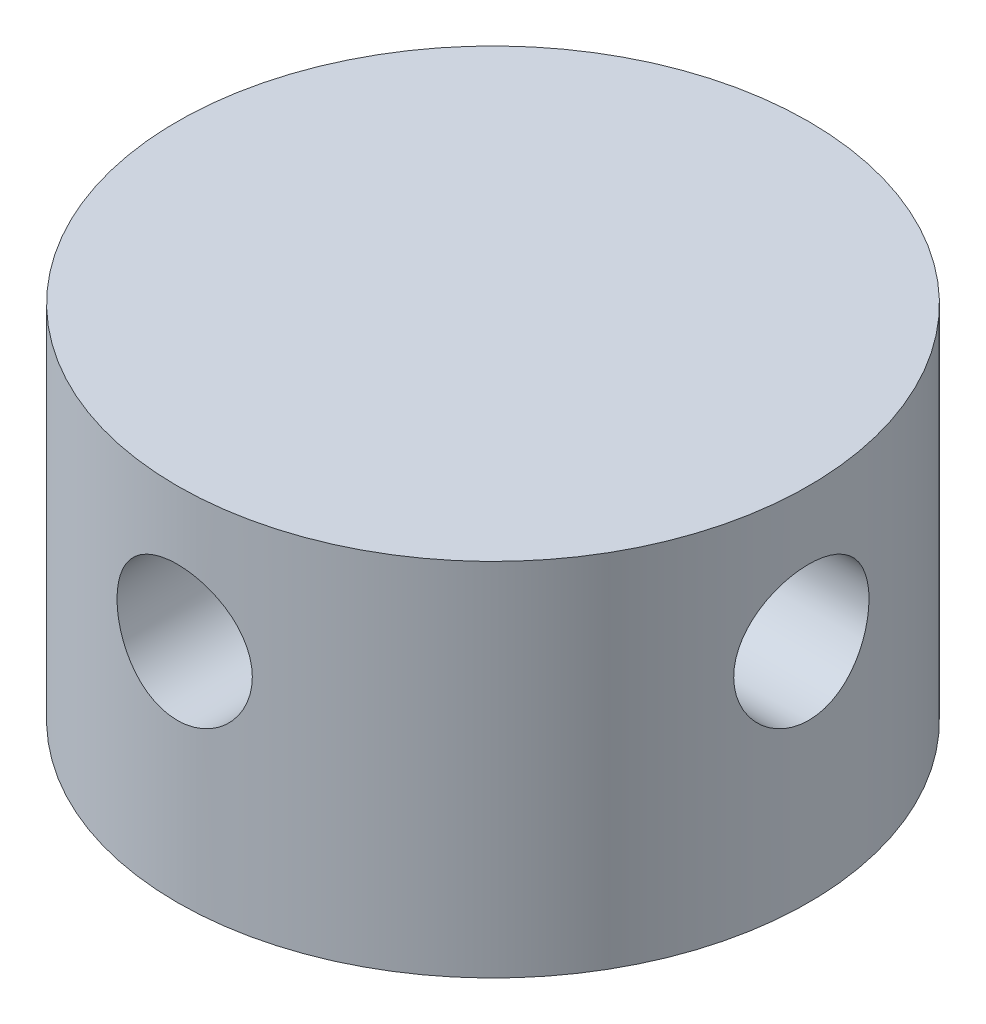
ISO-10303-21;
HEADER;
FILE_DESCRIPTION(('STEP AP214'),'2;1');
FILE_NAME('part.step','',(''),(''),'','','');
FILE_SCHEMA(('AUTOMOTIVE_DESIGN { 1 0 10303 214 1 1 1 1 }'));
ENDSEC;
DATA;
#1=APPLICATION_CONTEXT('core data for automotive mechanical design processes');
#2=APPLICATION_PROTOCOL_DEFINITION('international standard','automotive_design',2000,#1);
#3=PRODUCT_CONTEXT('',#1,'mechanical');
#4=PRODUCT('Part','Part','',(#3));
#5=PRODUCT_RELATED_PRODUCT_CATEGORY('part','',(#4));
#6=PRODUCT_DEFINITION_FORMATION('','',#4);
#7=PRODUCT_DEFINITION_CONTEXT('part definition',#1,'design');
#8=PRODUCT_DEFINITION('design','',#6,#7);
#9=PRODUCT_DEFINITION_SHAPE('','',#8);
#10=(LENGTH_UNIT() NAMED_UNIT(*) SI_UNIT(.MILLI.,.METRE.));
#11=(NAMED_UNIT(*) PLANE_ANGLE_UNIT() SI_UNIT($,.RADIAN.));
#12=(NAMED_UNIT(*) SI_UNIT($,.STERADIAN.) SOLID_ANGLE_UNIT());
#13=UNCERTAINTY_MEASURE_WITH_UNIT(LENGTH_MEASURE(1.E-05),#10,'distance_accuracy_value','');
#14=(GEOMETRIC_REPRESENTATION_CONTEXT(3) GLOBAL_UNCERTAINTY_ASSIGNED_CONTEXT((#13)) GLOBAL_UNIT_ASSIGNED_CONTEXT((#10,
#11,#12)) REPRESENTATION_CONTEXT('',''));
#15=CARTESIAN_POINT('',(0.,0.,0.));
#16=DIRECTION('',(0.,0.,1.));
#17=DIRECTION('',(1.,0.,0.));
#18=AXIS2_PLACEMENT_3D('',#15,#16,#17);
#19=CARTESIAN_POINT('',(0.,16.,0.));
#20=DIRECTION('',(0.,-1.,0.));
#21=DIRECTION('',(0.,0.,-1.));
#22=AXIS2_PLACEMENT_3D('',#19,#20,#21);
#23=CYLINDRICAL_SURFACE('',#22,14.);
#24=CARTESIAN_POINT('',(2.99999999999995,9.99536264570849,13.6747943311774));
#25=CARTESIAN_POINT('',(2.99999416477348,9.82894034074246,13.6747976912119));
#26=CARTESIAN_POINT('',(2.98610472489565,9.66244709782367,13.6778654468474));
#27=CARTESIAN_POINT('',(2.9309711850596,9.33418930122505,13.6897835685885));
#28=CARTESIAN_POINT('',(2.8897067930723,9.17242834835623,13.6986382242345));
#29=CARTESIAN_POINT('',(2.78117727369203,8.85843114655992,13.7210823058705));
#30=CARTESIAN_POINT('',(2.71394001982626,8.70618488946551,13.7346666545171));
#31=CARTESIAN_POINT('',(2.55545235346674,8.4151320978193,13.7650334169723));
#32=CARTESIAN_POINT('',(2.46420264097546,8.27632517165034,13.7818157375507));
#33=CARTESIAN_POINT('',(2.25870285140437,8.01383672274423,13.8169915759333));
#34=CARTESIAN_POINT('',(2.14413718967961,7.89040489322856,13.8354049974351));
#35=CARTESIAN_POINT('',(1.8959390162591,7.66435553689692,13.8715938342079));
#36=CARTESIAN_POINT('',(1.7623050604353,7.56173958798835,13.8893692010283));
#37=CARTESIAN_POINT('',(1.47809457692912,7.37925175672562,13.9224953821887));
#38=CARTESIAN_POINT('',(1.32736097645986,7.29961933416725,13.9378199763886));
#39=CARTESIAN_POINT('',(1.01426853868514,7.1669072628159,13.9640934208587));
#40=CARTESIAN_POINT('',(0.851910954760575,7.11382475613592,13.9750427420666));
#41=CARTESIAN_POINT('',(0.522774375342975,7.0365027038458,13.9911913056236));
#42=CARTESIAN_POINT('',(0.356098801193798,7.01184078860363,13.9964746675677));
#43=CARTESIAN_POINT('',(0.0208978906132403,6.99074009108197,14.00098724414));
#44=CARTESIAN_POINT('',(-0.147627240329568,6.99429820458697,14.000217124654));
#45=CARTESIAN_POINT('',(-0.478834058501073,7.02922057503565,13.9927740172512));
#46=CARTESIAN_POINT('',(-0.641566230724274,7.06012964628833,13.9861976630486));
#47=CARTESIAN_POINT('',(-0.959478927956827,7.14815200941221,13.9679908317821));
#48=CARTESIAN_POINT('',(-1.11465912035016,7.20526645430797,13.9563601323304));
#49=CARTESIAN_POINT('',(-1.41433499511315,7.34448556348552,13.9291950929371));
#50=CARTESIAN_POINT('',(-1.55874731403163,7.42676418011718,13.9136337160789));
#51=CARTESIAN_POINT('',(-1.83188185312574,7.61384658203568,13.8803158748773));
#52=CARTESIAN_POINT('',(-1.96060201290311,7.71865332030909,13.8625591228939));
#53=CARTESIAN_POINT('',(-2.20140417600401,7.95029973476421,13.8263865292185));
#54=CARTESIAN_POINT('',(-2.31310234640506,8.07753780442256,13.807964607457));
#55=CARTESIAN_POINT('',(-2.51364486469461,8.3491292158455,13.7728713366395));
#56=CARTESIAN_POINT('',(-2.60248864236141,8.49348298451898,13.7562000312677));
#57=CARTESIAN_POINT('',(-2.75496155146598,8.79581164783601,13.7264804717344));
#58=CARTESIAN_POINT('',(-2.8185207017785,8.95382289341336,13.7134423025555));
#59=CARTESIAN_POINT('',(-2.91806990318236,9.27862817760136,13.6926068161323));
#60=CARTESIAN_POINT('',(-2.9540641338926,9.44542088059487,13.6848087043696));
#61=CARTESIAN_POINT('',(-2.99687172049309,9.77955415100791,13.6754976251089));
#62=CARTESIAN_POINT('',(-3.00424283857285,9.9468199958631,13.673864541034));
#63=CARTESIAN_POINT('',(-2.99110279284752,10.2801906320719,13.6767447914799));
#64=CARTESIAN_POINT('',(-2.97059346163275,10.4462954990156,13.6812577220212));
#65=CARTESIAN_POINT('',(-2.90275789271173,10.77070351567,13.6958083096841));
#66=CARTESIAN_POINT('',(-2.85573660503112,10.9290735109024,13.7057831054873));
#67=CARTESIAN_POINT('',(-2.73654105893504,11.2356873207743,13.7300771973955));
#68=CARTESIAN_POINT('',(-2.66436447325641,11.3839301969769,13.744396895457));
#69=CARTESIAN_POINT('',(-2.49567008833415,11.6685020152263,13.7760326816069));
#70=CARTESIAN_POINT('',(-2.39880737181589,11.8046218097329,13.7933900349263));
#71=CARTESIAN_POINT('',(-2.18394367667206,12.0588793374561,13.8290355072028));
#72=CARTESIAN_POINT('',(-2.06594018364327,12.1770149286054,13.8473237366892));
#73=CARTESIAN_POINT('',(-1.80962552884168,12.394103251598,13.8831647998035));
#74=CARTESIAN_POINT('',(-1.67098985165759,12.4926764780225,13.9006987121549));
#75=CARTESIAN_POINT('',(-1.3788029625646,12.6651334644106,13.932712214298));
#76=CARTESIAN_POINT('',(-1.22525243208753,12.7390183516541,13.9471919435339));
#77=CARTESIAN_POINT('',(-0.908530837964129,12.8594667549854,13.9713855676315));
#78=CARTESIAN_POINT('',(-0.745426386150395,12.906199253201,13.9811288760739));
#79=CARTESIAN_POINT('',(-0.413450354006625,12.9715460571731,13.9948787860397));
#80=CARTESIAN_POINT('',(-0.244579579948027,12.9901642776563,13.9988861862461));
#81=CARTESIAN_POINT('',(0.0905274341056023,12.9985839505322,14.000690220181));
#82=CARTESIAN_POINT('',(0.256749011018382,12.9889529629178,13.9986091800327));
#83=CARTESIAN_POINT('',(0.585145876831902,12.9424131186704,13.9887310472683));
#84=CARTESIAN_POINT('',(0.747321232810627,12.9055047145517,13.9809340494761));
#85=CARTESIAN_POINT('',(1.06260389697439,12.8057250332097,13.9605077727683));
#86=CARTESIAN_POINT('',(1.21573673014591,12.7429312669381,13.9478929286009));
#87=CARTESIAN_POINT('',(1.50936991344679,12.5932401033696,13.9191807210222));
#88=CARTESIAN_POINT('',(1.6498690895937,12.5063404690939,13.9030830344402));
#89=CARTESIAN_POINT('',(1.91702461378895,12.3090380082257,13.8687961986559));
#90=CARTESIAN_POINT('',(2.04338073020588,12.1982343290756,13.8505741780296));
#91=CARTESIAN_POINT('',(2.27590002915842,11.957081425198,13.8142738016446));
#92=CARTESIAN_POINT('',(2.38205836126937,11.8267275189607,13.7961954813913));
#93=CARTESIAN_POINT('',(2.57246523191557,11.5481816593692,13.761973872554));
#94=CARTESIAN_POINT('',(2.65641795611839,11.399783929263,13.7458581173137));
#95=CARTESIAN_POINT('',(2.79806009312266,11.0906752039917,13.7177299427787));
#96=CARTESIAN_POINT('',(2.85577212846055,10.9299749552366,13.7057139912142));
#97=CARTESIAN_POINT('',(2.93277214244337,10.6401103833161,13.6894112131582));
#98=CARTESIAN_POINT('',(2.95793505015813,10.5125392942873,13.683965661845));
#99=CARTESIAN_POINT('',(2.99155088086538,10.2551140225594,13.6766559900021));
#100=CARTESIAN_POINT('',(3.00000455455859,10.1252599426935,13.6747917085757));
#101=CARTESIAN_POINT('',(2.99999999999995,9.99536264570849,13.6747943311774));
#102=B_SPLINE_CURVE_WITH_KNOTS('',3,(#24,#25,#26,#27,#28,#29,#30,#31,#32,#33,#34,#35,#36,#37,
#38,#39,#40,#41,#42,#43,#44,#45,#46,#47,#48,#49,#50,#51,#52,#53,#54,#55,#56,#57,#58,#59,#60,#61,
#62,#63,#64,#65,#66,#67,#68,#69,#70,#71,#72,#73,#74,#75,#76,#77,#78,#79,#80,#81,#82,#83,#84,#85,
#86,#87,#88,#89,#90,#91,#92,#93,#94,#95,#96,#97,#98,#99,#100,#101),.UNSPECIFIED.,.T.,.F.,(4,2,2,
2,2,2,2,2,2,2,2,2,2,2,2,2,2,2,2,2,2,2,2,2,2,2,2,2,2,2,2,2,2,2,2,2,2,2,4),(0.,0.498790964055055,
0.997952076959928,1.49657898230552,1.99519135347057,2.50106459165384,3.00697616225757,
3.51798269640557,4.02893421292535,4.53219016303857,5.03539075554482,5.53037115334743,
6.02537333215167,6.52387776286874,7.0224475774463,7.5309792155859,8.03952354046184,
8.54946574823562,9.05933061907677,9.55920866385046,10.0590538530783,10.5532636149875,
11.047519111263,11.5491002043264,12.0507409931816,12.5613242936642,13.0718842775108,
13.5792317964875,14.0865086641708,14.5836639928825,15.080811074302,15.5764801923897,
16.0721953230273,16.5769782832193,17.0818823126246,17.593207603363,18.1040912322742,
18.4934291224859,18.8827495204009),.UNSPECIFIED.);
#103=CARTESIAN_POINT('',(2.99999999999995,9.99536264570849,13.6747943311774));
#104=VERTEX_POINT('',#103);
#105=EDGE_CURVE('E10',#104,#104,#102,.T.);
#106=ORIENTED_EDGE('',*,*,#105,.T.);
#107=EDGE_LOOP('',(#106));
#108=FACE_BOUND('',#107,.T.);
#109=CARTESIAN_POINT('',(-13.6747943311773,9.99536264570849,3.));
#110=CARTESIAN_POINT('',(-13.6747976912119,9.82894034074246,2.99999416477353));
#111=CARTESIAN_POINT('',(-13.6778654468474,9.66244709782367,2.9861047248957));
#112=CARTESIAN_POINT('',(-13.6897835685885,9.33418930122505,2.93097118505965));
#113=CARTESIAN_POINT('',(-13.6986382242345,9.17242834835623,2.88970679307235));
#114=CARTESIAN_POINT('',(-13.7210823058705,8.85843114655992,2.78117727369208));
#115=CARTESIAN_POINT('',(-13.7346666545171,8.70618488946551,2.71394001982631));
#116=CARTESIAN_POINT('',(-13.7650334169723,8.4151320978193,2.55545235346679));
#117=CARTESIAN_POINT('',(-13.7818157375507,8.27632517165034,2.46420264097551));
#118=CARTESIAN_POINT('',(-13.8169915759332,8.01383672274423,2.25870285140442));
#119=CARTESIAN_POINT('',(-13.8354049974351,7.89040489322856,2.14413718967966));
#120=CARTESIAN_POINT('',(-13.8715938342079,7.66435553689692,1.89593901625915));
#121=CARTESIAN_POINT('',(-13.8893692010283,7.56173958798835,1.76230506043535));
#122=CARTESIAN_POINT('',(-13.9224953821886,7.37925175672562,1.47809457692916));
#123=CARTESIAN_POINT('',(-13.9378199763886,7.29961933416725,1.32736097645991));
#124=CARTESIAN_POINT('',(-13.9640934208587,7.1669072628159,1.01426853868519));
#125=CARTESIAN_POINT('',(-13.9750427420666,7.11382475613593,0.851910954760624));
#126=CARTESIAN_POINT('',(-13.9911913056236,7.0365027038458,0.522774375343024));
#127=CARTESIAN_POINT('',(-13.9964746675677,7.01184078860363,0.356098801193847));
#128=CARTESIAN_POINT('',(-14.00098724414,6.99074009108197,0.0208978906132897));
#129=CARTESIAN_POINT('',(-14.000217124654,6.99429820458697,-0.147627240329518));
#130=CARTESIAN_POINT('',(-13.9927740172512,7.02922057503565,-0.478834058501023));
#131=CARTESIAN_POINT('',(-13.9861976630486,7.06012964628833,-0.641566230724225));
#132=CARTESIAN_POINT('',(-13.9679908317821,7.14815200941221,-0.959478927956778));
#133=CARTESIAN_POINT('',(-13.9563601323304,7.20526645430797,-1.11465912035011));
#134=CARTESIAN_POINT('',(-13.9291950929372,7.34448556348552,-1.41433499511311));
#135=CARTESIAN_POINT('',(-13.9136337160789,7.42676418011718,-1.55874731403158));
#136=CARTESIAN_POINT('',(-13.8803158748773,7.61384658203568,-1.83188185312569));
#137=CARTESIAN_POINT('',(-13.8625591228939,7.71865332030909,-1.96060201290306));
#138=CARTESIAN_POINT('',(-13.8263865292185,7.95029973476421,-2.20140417600396));
#139=CARTESIAN_POINT('',(-13.8079646074571,8.07753780442255,-2.31310234640501));
#140=CARTESIAN_POINT('',(-13.7728713366395,8.3491292158455,-2.51364486469456));
#141=CARTESIAN_POINT('',(-13.7562000312677,8.49348298451898,-2.60248864236136));
#142=CARTESIAN_POINT('',(-13.7264804717345,8.79581164783601,-2.75496155146593));
#143=CARTESIAN_POINT('',(-13.7134423025555,8.95382289341336,-2.81852070177845));
#144=CARTESIAN_POINT('',(-13.6926068161323,9.27862817760136,-2.91806990318231));
#145=CARTESIAN_POINT('',(-13.6848087043697,9.44542088059487,-2.95406413389256));
#146=CARTESIAN_POINT('',(-13.6754976251089,9.77955415100791,-2.99687172049304));
#147=CARTESIAN_POINT('',(-13.673864541034,9.9468199958631,-3.0042428385728));
#148=CARTESIAN_POINT('',(-13.6767447914799,10.2801906320719,-2.99110279284747));
#149=CARTESIAN_POINT('',(-13.6812577220213,10.4462954990156,-2.9705934616327));
#150=CARTESIAN_POINT('',(-13.6958083096841,10.77070351567,-2.90275789271168));
#151=CARTESIAN_POINT('',(-13.7057831054873,10.9290735109024,-2.85573660503107));
#152=CARTESIAN_POINT('',(-13.7300771973955,11.2356873207743,-2.73654105893499));
#153=CARTESIAN_POINT('',(-13.744396895457,11.3839301969769,-2.66436447325636));
#154=CARTESIAN_POINT('',(-13.7760326816069,11.6685020152263,-2.4956700883341));
#155=CARTESIAN_POINT('',(-13.7933900349263,11.8046218097329,-2.39880737181584));
#156=CARTESIAN_POINT('',(-13.8290355072028,12.0588793374561,-2.18394367667201));
#157=CARTESIAN_POINT('',(-13.8473237366892,12.1770149286054,-2.06594018364322));
#158=CARTESIAN_POINT('',(-13.8831647998035,12.394103251598,-1.80962552884163));
#159=CARTESIAN_POINT('',(-13.9006987121549,12.4926764780225,-1.67098985165754));
#160=CARTESIAN_POINT('',(-13.932712214298,12.6651334644106,-1.37880296256455));
#161=CARTESIAN_POINT('',(-13.9471919435339,12.7390183516541,-1.22525243208748));
#162=CARTESIAN_POINT('',(-13.9713855676315,12.8594667549854,-0.90853083796408));
#163=CARTESIAN_POINT('',(-13.9811288760739,12.906199253201,-0.745426386150346));
#164=CARTESIAN_POINT('',(-13.9948787860397,12.9715460571731,-0.413450354006576));
#165=CARTESIAN_POINT('',(-13.9988861862461,12.9901642776563,-0.244579579947978));
#166=CARTESIAN_POINT('',(-14.000690220181,12.9985839505322,0.090527434105651));
#167=CARTESIAN_POINT('',(-13.9986091800327,12.9889529629178,0.256749011018431));
#168=CARTESIAN_POINT('',(-13.9887310472683,12.9424131186704,0.58514587683195));
#169=CARTESIAN_POINT('',(-13.9809340494761,12.9055047145517,0.747321232810676));
#170=CARTESIAN_POINT('',(-13.9605077727683,12.8057250332097,1.06260389697443));
#171=CARTESIAN_POINT('',(-13.9478929286009,12.7429312669381,1.21573673014596));
#172=CARTESIAN_POINT('',(-13.9191807210221,12.5932401033696,1.50936991344683));
#173=CARTESIAN_POINT('',(-13.9030830344402,12.5063404690939,1.64986908959375));
#174=CARTESIAN_POINT('',(-13.8687961986559,12.3090380082257,1.91702461378899));
#175=CARTESIAN_POINT('',(-13.8505741780296,12.1982343290757,2.04338073020593));
#176=CARTESIAN_POINT('',(-13.8142738016446,11.957081425198,2.27590002915847));
#177=CARTESIAN_POINT('',(-13.7961954813912,11.8267275189607,2.38205836126942));
#178=CARTESIAN_POINT('',(-13.761973872554,11.5481816593692,2.57246523191562));
#179=CARTESIAN_POINT('',(-13.7458581173137,11.399783929263,2.65641795611844));
#180=CARTESIAN_POINT('',(-13.7177299427787,11.0906752039917,2.79806009312271));
#181=CARTESIAN_POINT('',(-13.7057139912142,10.9299749552366,2.8557721284606));
#182=CARTESIAN_POINT('',(-13.6894112131582,10.6401103833161,2.93277214244341));
#183=CARTESIAN_POINT('',(-13.683965661845,10.5125392942873,2.95793505015818));
#184=CARTESIAN_POINT('',(-13.6766559900021,10.2551140225594,2.99155088086543));
#185=CARTESIAN_POINT('',(-13.6747917085757,10.1252599426935,3.00000455455863));
#186=CARTESIAN_POINT('',(-13.6747943311773,9.99536264570849,3.));
#187=B_SPLINE_CURVE_WITH_KNOTS('',3,(#109,#110,#111,#112,#113,#114,#115,#116,#117,#118,#119,
#120,#121,#122,#123,#124,#125,#126,#127,#128,#129,#130,#131,#132,#133,#134,#135,#136,#137,#138,
#139,#140,#141,#142,#143,#144,#145,#146,#147,#148,#149,#150,#151,#152,#153,#154,#155,#156,#157,
#158,#159,#160,#161,#162,#163,#164,#165,#166,#167,#168,#169,#170,#171,#172,#173,#174,#175,#176,
#177,#178,#179,#180,#181,#182,#183,#184,#185,#186),.UNSPECIFIED.,.T.,.F.,(4,2,2,2,2,2,2,2,2,2,2,
2,2,2,2,2,2,2,2,2,2,2,2,2,2,2,2,2,2,2,2,2,2,2,2,2,2,2,4),(0.,0.498790964055055,
0.997952076959928,1.49657898230552,1.99519135347057,2.50106459165384,3.00697616225757,
3.51798269640557,4.02893421292535,4.53219016303857,5.03539075554482,5.53037115334743,
6.02537333215167,6.52387776286874,7.02244757744629,7.5309792155859,8.03952354046184,
8.54946574823562,9.05933061907677,9.55920866385046,10.0590538530783,10.5532636149875,
11.047519111263,11.5491002043264,12.0507409931816,12.5613242936642,13.0718842775108,
13.5792317964875,14.0865086641708,14.5836639928825,15.080811074302,15.5764801923897,
16.0721953230273,16.5769782832193,17.0818823126246,17.593207603363,18.1040912322742,
18.4934291224859,18.8827495204009),.UNSPECIFIED.);
#188=CARTESIAN_POINT('',(-13.6747943311773,9.99536264570849,3.));
#189=VERTEX_POINT('',#188);
#190=EDGE_CURVE('E43',#189,#189,#187,.T.);
#191=ORIENTED_EDGE('',*,*,#190,.T.);
#192=EDGE_LOOP('',(#191));
#193=FACE_BOUND('',#192,.T.);
#194=CARTESIAN_POINT('',(0.,12.9953626457085,-14.));
#195=CARTESIAN_POINT('',(-0.166471772181234,12.9953568465599,-13.9999969208645));
#196=CARTESIAN_POINT('',(-0.333014391200549,12.9814594289328,-13.9970005189942));
#197=CARTESIAN_POINT('',(-0.661374688586652,12.9262913320013,-13.9853365965546));
#198=CARTESIAN_POINT('',(-0.823188807142376,12.8850005573186,-13.976664912742));
#199=CARTESIAN_POINT('',(-1.13729864763546,12.7763939164924,-13.9546166357765));
#200=CARTESIAN_POINT('',(-1.2896039268931,12.7091046869458,-13.9412448593434));
#201=CARTESIAN_POINT('',(-1.58075635592156,12.5504944733659,-13.9112421363594));
#202=CARTESIAN_POINT('',(-1.71960396349472,12.4591743072085,-13.8946113007332));
#203=CARTESIAN_POINT('',(-1.98204958107043,12.2536020463614,-13.8596273849262));
#204=CARTESIAN_POINT('',(-2.10541006838887,12.1390502019113,-13.8412536628652));
#205=CARTESIAN_POINT('',(-2.33132084778865,11.890910014338,-13.8050013962829));
#206=CARTESIAN_POINT('',(-2.43386934301811,11.7573200292058,-13.7871228946326));
#207=CARTESIAN_POINT('',(-2.6162840875961,11.4731511399875,-13.7536823209445));
#208=CARTESIAN_POINT('',(-2.6958991667001,11.3224076101959,-13.7381467268872));
#209=CARTESIAN_POINT('',(-2.82857647382286,11.0092937381747,-13.7114465111708));
#210=CARTESIAN_POINT('',(-2.88164174003421,10.8469247287232,-13.7002813894142));
#211=CARTESIAN_POINT('',(-2.95893148844897,10.5177404725322,-13.6837961785262));
#212=CARTESIAN_POINT('',(-2.98357559496672,10.3510280943806,-13.6783911379298));
#213=CARTESIAN_POINT('',(-3.0046279041314,10.0157541806943,-13.6737827969021));
#214=CARTESIAN_POINT('',(-3.00103943329244,9.84719286534844,-13.6745787658346));
#215=CARTESIAN_POINT('',(-2.96606652681706,9.51611326984075,-13.6822055320767));
#216=CARTESIAN_POINT('',(-2.93516797298799,9.35354086750803,-13.6889308336433));
#217=CARTESIAN_POINT('',(-2.84722108597335,9.03594216512966,-13.7074918675158));
#218=CARTESIAN_POINT('',(-2.79017133872912,8.88091627364371,-13.7193278761681));
#219=CARTESIAN_POINT('',(-2.65109102151961,8.58143689996168,-13.7468816151145));
#220=CARTESIAN_POINT('',(-2.56887221945638,8.43707362028326,-13.7626284196673));
#221=CARTESIAN_POINT('',(-2.38192014567963,8.16401231579245,-13.7962114500258));
#222=CARTESIAN_POINT('',(-2.277183922071,8.03531634833597,-13.814047949638));
#223=CARTESIAN_POINT('',(-2.04559085510615,7.79444393436159,-13.8502543678776));
#224=CARTESIAN_POINT('',(-1.91832046792856,7.68266523253891,-13.8686276794436));
#225=CARTESIAN_POINT('',(-1.64663461253792,7.48197517832908,-13.9035003499412));
#226=CARTESIAN_POINT('',(-1.50221885755052,7.39306420850763,-13.9199996775195));
#227=CARTESIAN_POINT('',(-1.19986692409963,7.24054128589457,-13.9493155706801));
#228=CARTESIAN_POINT('',(-1.04190451772668,7.17697982055247,-13.9621247728671));
#229=CARTESIAN_POINT('',(-0.71720629337112,7.07741134906628,-13.9825621849067));
#230=CARTESIAN_POINT('',(-0.550471702267044,7.04140050058183,-13.9901911172077));
#231=CARTESIAN_POINT('',(-0.216375341672962,6.99853021742163,-13.9993061269562));
#232=CARTESIAN_POINT('',(-0.049086354542933,6.99112721994492,-14.0009067304213));
#233=CARTESIAN_POINT('',(0.284337947301104,7.00421178795883,-13.9981049787194));
#234=CARTESIAN_POINT('',(0.450473336254803,7.02469754163439,-13.9937030135139));
#235=CARTESIAN_POINT('',(0.7750850759659,7.09252713303193,-13.9794628609053));
#236=CARTESIAN_POINT('',(0.933623425817241,7.1395873846536,-13.9696821009092));
#237=CARTESIAN_POINT('',(1.24055690094712,7.25891653169819,-13.9457784884302));
#238=CARTESIAN_POINT('',(1.38895118517576,7.33118751433186,-13.9316552764447));
#239=CARTESIAN_POINT('',(1.67364279592978,7.50002973182922,-13.900350087808));
#240=CARTESIAN_POINT('',(1.80974515022254,7.59692223552803,-13.8831286270855));
#241=CARTESIAN_POINT('',(2.06395385104744,7.81183229548606,-13.8476206606969));
#242=CARTESIAN_POINT('',(2.18205795738424,7.92985247748348,-13.8293340228419));
#243=CARTESIAN_POINT('',(2.39905422116002,8.18615738608288,-13.7933634541264));
#244=CARTESIAN_POINT('',(2.49757074510336,8.32476284415282,-13.7756958444257));
#245=CARTESIAN_POINT('',(2.66992830772102,8.61687183866461,-13.7433330911936));
#246=CARTESIAN_POINT('',(2.74377039827432,8.77037473966361,-13.7286378209611));
#247=CARTESIAN_POINT('',(2.86419482497114,9.08710724369784,-13.7040201961478));
#248=CARTESIAN_POINT('',(2.91092797282568,9.25027735856997,-13.6940714916593));
#249=CARTESIAN_POINT('',(2.97625392170687,9.58239381337591,-13.6800237341683));
#250=CARTESIAN_POINT('',(2.99485101560531,9.75133926811128,-13.6759237887941));
#251=CARTESIAN_POINT('',(3.00319999852095,10.0864273320591,-13.6740923769631));
#252=CARTESIAN_POINT('',(2.99354694516635,10.2525546756698,-13.6762295303708));
#253=CARTESIAN_POINT('',(2.94699578812673,10.5807571299738,-13.6863352636966));
#254=CARTESIAN_POINT('',(2.91009797915969,10.7428322844818,-13.6943037805343));
#255=CARTESIAN_POINT('',(2.81038691880876,11.057879961447,-13.7151116220831));
#256=CARTESIAN_POINT('',(2.74765694341782,11.2108799430372,-13.727935284494));
#257=CARTESIAN_POINT('',(2.59813503191208,11.5042733907223,-13.757015291813));
#258=CARTESIAN_POINT('',(2.51134070603005,11.6446656029387,-13.7732719776072));
#259=CARTESIAN_POINT('',(2.31416580698612,11.9117990331593,-13.8077811118646));
#260=CARTESIAN_POINT('',(2.20335974842477,12.0382220376025,-13.8260661987785));
#261=CARTESIAN_POINT('',(1.96217310923927,12.2708751707495,-13.8623489959939));
#262=CARTESIAN_POINT('',(1.83178801877122,12.377100634333,-13.8803466390259));
#263=CARTESIAN_POINT('',(1.55320629453745,12.5675945647197,-13.9142898209797));
#264=CARTESIAN_POINT('',(1.40480969201929,12.6515758581705,-13.9302072914125));
#265=CARTESIAN_POINT('',(1.0957003218812,12.7932717035209,-13.9579165220804));
#266=CARTESIAN_POINT('',(0.934998211727761,12.8510086908786,-13.9697118042469));
#267=CARTESIAN_POINT('',(0.645070435106406,12.9280670159708,-13.9856969692354));
#268=CARTESIAN_POINT('',(0.517434411091956,12.9532555136686,-13.9910278377653));
#269=CARTESIAN_POINT('',(0.259879921707691,12.9869052491318,-13.9981804830944));
#270=CARTESIAN_POINT('',(0.129961550177489,12.9953671730006,-14.0000024038263));
#271=CARTESIAN_POINT('',(0.,12.9953626457085,-14.));
#272=B_SPLINE_CURVE_WITH_KNOTS('',3,(#194,#195,#196,#197,#198,#199,#200,#201,#202,#203,#204,
#205,#206,#207,#208,#209,#210,#211,#212,#213,#214,#215,#216,#217,#218,#219,#220,#221,#222,#223,
#224,#225,#226,#227,#228,#229,#230,#231,#232,#233,#234,#235,#236,#237,#238,#239,#240,#241,#242,
#243,#244,#245,#246,#247,#248,#249,#250,#251,#252,#253,#254,#255,#256,#257,#258,#259,#260,#261,
#262,#263,#264,#265,#266,#267,#268,#269,#270,#271),.UNSPECIFIED.,.T.,.F.,(4,2,2,2,2,2,2,2,2,2,2,
2,2,2,2,2,2,2,2,2,2,2,2,2,2,2,2,2,2,2,2,2,2,2,2,2,2,2,4),(0.,0.498939673024165,
0.998245766439873,1.49704164885121,1.99582055729178,2.50149923763465,3.00722155837013,
3.51828858429021,4.0292971135498,4.53266016249332,5.0359639033833,5.53048950905855,
6.02504185809137,6.52338712331936,7.02179775841779,7.53054022100582,8.03929119404701,
8.54905042279612,9.05873854512687,9.5586933140837,10.0586156046286,10.5533012117853,
11.0480277839687,11.5495746773561,12.0511839460897,12.5616412656707,13.0720768215161,
13.5796448081695,14.0871353445837,14.5840136108059,15.0808865021654,15.5761699941357,
16.0715026890325,16.5764590030823,17.0815318079423,17.5928382071444,18.1037066802054,
18.4932359826459,18.8827493067467),.UNSPECIFIED.);
#273=CARTESIAN_POINT('',(0.,12.9953626457085,-14.));
#274=VERTEX_POINT('',#273);
#275=EDGE_CURVE('E47',#274,#274,#272,.T.);
#276=ORIENTED_EDGE('',*,*,#275,.T.);
#277=EDGE_LOOP('',(#276));
#278=FACE_BOUND('',#277,.T.);
#279=CARTESIAN_POINT('',(13.6747943311773,9.99536264570849,-3.));
#280=CARTESIAN_POINT('',(13.6747976912119,9.82894034074246,-2.99999416477353));
#281=CARTESIAN_POINT('',(13.6778654468474,9.66244709782367,-2.9861047248957));
#282=CARTESIAN_POINT('',(13.6897835685885,9.33418930122505,-2.93097118505965));
#283=CARTESIAN_POINT('',(13.6986382242345,9.17242834835623,-2.88970679307235));
#284=CARTESIAN_POINT('',(13.7210823058705,8.85843114655992,-2.78117727369208));
#285=CARTESIAN_POINT('',(13.7346666545171,8.70618488946551,-2.71394001982631));
#286=CARTESIAN_POINT('',(13.7650334169723,8.4151320978193,-2.55545235346679));
#287=CARTESIAN_POINT('',(13.7818157375507,8.27632517165034,-2.46420264097551));
#288=CARTESIAN_POINT('',(13.8169915759332,8.01383672274423,-2.25870285140442));
#289=CARTESIAN_POINT('',(13.8354049974351,7.89040489322856,-2.14413718967966));
#290=CARTESIAN_POINT('',(13.8715938342079,7.66435553689692,-1.89593901625915));
#291=CARTESIAN_POINT('',(13.8893692010283,7.56173958798835,-1.76230506043535));
#292=CARTESIAN_POINT('',(13.9224953821886,7.37925175672562,-1.47809457692916));
#293=CARTESIAN_POINT('',(13.9378199763886,7.29961933416725,-1.32736097645991));
#294=CARTESIAN_POINT('',(13.9640934208587,7.1669072628159,-1.01426853868519));
#295=CARTESIAN_POINT('',(13.9750427420666,7.11382475613593,-0.851910954760624));
#296=CARTESIAN_POINT('',(13.9911913056236,7.0365027038458,-0.522774375343024));
#297=CARTESIAN_POINT('',(13.9964746675677,7.01184078860363,-0.356098801193847));
#298=CARTESIAN_POINT('',(14.00098724414,6.99074009108197,-0.0208978906132897));
#299=CARTESIAN_POINT('',(14.000217124654,6.99429820458697,0.147627240329518));
#300=CARTESIAN_POINT('',(13.9927740172512,7.02922057503565,0.478834058501023));
#301=CARTESIAN_POINT('',(13.9861976630486,7.06012964628833,0.641566230724225));
#302=CARTESIAN_POINT('',(13.9679908317821,7.14815200941221,0.959478927956778));
#303=CARTESIAN_POINT('',(13.9563601323304,7.20526645430797,1.11465912035011));
#304=CARTESIAN_POINT('',(13.9291950929372,7.34448556348552,1.41433499511311));
#305=CARTESIAN_POINT('',(13.9136337160789,7.42676418011718,1.55874731403158));
#306=CARTESIAN_POINT('',(13.8803158748773,7.61384658203568,1.83188185312569));
#307=CARTESIAN_POINT('',(13.8625591228939,7.71865332030909,1.96060201290306));
#308=CARTESIAN_POINT('',(13.8263865292185,7.95029973476421,2.20140417600396));
#309=CARTESIAN_POINT('',(13.8079646074571,8.07753780442255,2.31310234640501));
#310=CARTESIAN_POINT('',(13.7728713366395,8.3491292158455,2.51364486469456));
#311=CARTESIAN_POINT('',(13.7562000312677,8.49348298451898,2.60248864236136));
#312=CARTESIAN_POINT('',(13.7264804717345,8.79581164783601,2.75496155146593));
#313=CARTESIAN_POINT('',(13.7134423025555,8.95382289341336,2.81852070177845));
#314=CARTESIAN_POINT('',(13.6926068161323,9.27862817760136,2.91806990318231));
#315=CARTESIAN_POINT('',(13.6848087043697,9.44542088059487,2.95406413389256));
#316=CARTESIAN_POINT('',(13.6754976251089,9.77955415100791,2.99687172049304));
#317=CARTESIAN_POINT('',(13.673864541034,9.9468199958631,3.0042428385728));
#318=CARTESIAN_POINT('',(13.6767447914799,10.2801906320719,2.99110279284747));
#319=CARTESIAN_POINT('',(13.6812577220213,10.4462954990156,2.9705934616327));
#320=CARTESIAN_POINT('',(13.6958083096841,10.77070351567,2.90275789271168));
#321=CARTESIAN_POINT('',(13.7057831054873,10.9290735109024,2.85573660503107));
#322=CARTESIAN_POINT('',(13.7300771973955,11.2356873207743,2.73654105893499));
#323=CARTESIAN_POINT('',(13.744396895457,11.3839301969769,2.66436447325636));
#324=CARTESIAN_POINT('',(13.7760326816069,11.6685020152263,2.4956700883341));
#325=CARTESIAN_POINT('',(13.7933900349263,11.8046218097329,2.39880737181584));
#326=CARTESIAN_POINT('',(13.8290355072028,12.0588793374561,2.18394367667201));
#327=CARTESIAN_POINT('',(13.8473237366892,12.1770149286054,2.06594018364322));
#328=CARTESIAN_POINT('',(13.8831647998035,12.394103251598,1.80962552884163));
#329=CARTESIAN_POINT('',(13.9006987121549,12.4926764780225,1.67098985165754));
#330=CARTESIAN_POINT('',(13.932712214298,12.6651334644106,1.37880296256455));
#331=CARTESIAN_POINT('',(13.9471919435339,12.7390183516541,1.22525243208748));
#332=CARTESIAN_POINT('',(13.9713855676315,12.8594667549854,0.90853083796408));
#333=CARTESIAN_POINT('',(13.9811288760739,12.906199253201,0.745426386150346));
#334=CARTESIAN_POINT('',(13.9948787860397,12.9715460571731,0.413450354006576));
#335=CARTESIAN_POINT('',(13.9988861862461,12.9901642776563,0.244579579947978));
#336=CARTESIAN_POINT('',(14.000690220181,12.9985839505322,-0.090527434105651));
#337=CARTESIAN_POINT('',(13.9986091800327,12.9889529629178,-0.256749011018431));
#338=CARTESIAN_POINT('',(13.9887310472683,12.9424131186704,-0.58514587683195));
#339=CARTESIAN_POINT('',(13.9809340494761,12.9055047145517,-0.747321232810676));
#340=CARTESIAN_POINT('',(13.9605077727683,12.8057250332097,-1.06260389697443));
#341=CARTESIAN_POINT('',(13.9478929286009,12.7429312669381,-1.21573673014596));
#342=CARTESIAN_POINT('',(13.9191807210221,12.5932401033696,-1.50936991344683));
#343=CARTESIAN_POINT('',(13.9030830344402,12.5063404690939,-1.64986908959375));
#344=CARTESIAN_POINT('',(13.8687961986559,12.3090380082257,-1.91702461378899));
#345=CARTESIAN_POINT('',(13.8505741780296,12.1982343290757,-2.04338073020593));
#346=CARTESIAN_POINT('',(13.8142738016446,11.957081425198,-2.27590002915847));
#347=CARTESIAN_POINT('',(13.7961954813912,11.8267275189607,-2.38205836126942));
#348=CARTESIAN_POINT('',(13.761973872554,11.5481816593692,-2.57246523191562));
#349=CARTESIAN_POINT('',(13.7458581173137,11.399783929263,-2.65641795611844));
#350=CARTESIAN_POINT('',(13.7177299427787,11.0906752039917,-2.79806009312271));
#351=CARTESIAN_POINT('',(13.7057139912142,10.9299749552366,-2.8557721284606));
#352=CARTESIAN_POINT('',(13.6894112131582,10.6401103833161,-2.93277214244341));
#353=CARTESIAN_POINT('',(13.683965661845,10.5125392942873,-2.95793505015818));
#354=CARTESIAN_POINT('',(13.6766559900021,10.2551140225594,-2.99155088086543));
#355=CARTESIAN_POINT('',(13.6747917085757,10.1252599426935,-3.00000455455863));
#356=CARTESIAN_POINT('',(13.6747943311773,9.99536264570849,-3.));
#357=B_SPLINE_CURVE_WITH_KNOTS('',3,(#279,#280,#281,#282,#283,#284,#285,#286,#287,#288,#289,
#290,#291,#292,#293,#294,#295,#296,#297,#298,#299,#300,#301,#302,#303,#304,#305,#306,#307,#308,
#309,#310,#311,#312,#313,#314,#315,#316,#317,#318,#319,#320,#321,#322,#323,#324,#325,#326,#327,
#328,#329,#330,#331,#332,#333,#334,#335,#336,#337,#338,#339,#340,#341,#342,#343,#344,#345,#346,
#347,#348,#349,#350,#351,#352,#353,#354,#355,#356),.UNSPECIFIED.,.T.,.F.,(4,2,2,2,2,2,2,2,2,2,2,
2,2,2,2,2,2,2,2,2,2,2,2,2,2,2,2,2,2,2,2,2,2,2,2,2,2,2,4),(0.,0.498790964055055,
0.997952076959928,1.49657898230552,1.99519135347057,2.50106459165384,3.00697616225757,
3.51798269640557,4.02893421292535,4.53219016303857,5.03539075554482,5.53037115334743,
6.02537333215167,6.52387776286874,7.02244757744629,7.5309792155859,8.03952354046184,
8.54946574823562,9.05933061907677,9.55920866385046,10.0590538530783,10.5532636149875,
11.047519111263,11.5491002043264,12.0507409931816,12.5613242936642,13.0718842775108,
13.5792317964875,14.0865086641708,14.5836639928825,15.080811074302,15.5764801923897,
16.0721953230273,16.5769782832193,17.0818823126246,17.593207603363,18.1040912322742,
18.4934291224859,18.8827495204009),.UNSPECIFIED.);
#358=CARTESIAN_POINT('',(13.6747943311773,9.99536264570849,-3.));
#359=VERTEX_POINT('',#358);
#360=EDGE_CURVE('E51',#359,#359,#357,.T.);
#361=ORIENTED_EDGE('',*,*,#360,.T.);
#362=EDGE_LOOP('',(#361));
#363=FACE_BOUND('',#362,.T.);
#364=CARTESIAN_POINT('',(0.,16.,0.));
#365=DIRECTION('',(0.,1.,0.));
#366=DIRECTION('',(0.,0.,1.));
#367=AXIS2_PLACEMENT_3D('',#364,#365,#366);
#368=CIRCLE('',#367,14.);
#369=CARTESIAN_POINT('',(0.,16.,14.));
#370=VERTEX_POINT('',#369);
#371=EDGE_CURVE('E90',#370,#370,#368,.T.);
#372=ORIENTED_EDGE('',*,*,#371,.F.);
#373=EDGE_LOOP('',(#372));
#374=FACE_BOUND('',#373,.T.);
#375=CARTESIAN_POINT('',(0.,0.,0.));
#376=DIRECTION('',(0.,1.,0.));
#377=DIRECTION('',(0.,0.,1.));
#378=AXIS2_PLACEMENT_3D('',#375,#376,#377);
#379=CIRCLE('',#378,14.);
#380=CARTESIAN_POINT('',(0.,0.,14.));
#381=VERTEX_POINT('',#380);
#382=EDGE_CURVE('E91',#381,#381,#379,.T.);
#383=ORIENTED_EDGE('',*,*,#382,.T.);
#384=EDGE_LOOP('',(#383));
#385=FACE_BOUND('',#384,.T.);
#386=ADVANCED_FACE('F33',(#108,#193,#278,#363,#374,#385),#23,.T.);
#387=CARTESIAN_POINT('',(0.,16.,0.));
#388=DIRECTION('',(0.,1.,0.));
#389=DIRECTION('',(0.,0.,1.));
#390=AXIS2_PLACEMENT_3D('',#387,#388,#389);
#391=PLANE('',#390);
#392=ORIENTED_EDGE('',*,*,#371,.T.);
#393=EDGE_LOOP('',(#392));
#394=FACE_BOUND('',#393,.T.);
#395=ADVANCED_FACE('F85',(#394),#391,.T.);
#396=CARTESIAN_POINT('',(0.,0.,0.));
#397=DIRECTION('',(0.,1.,0.));
#398=DIRECTION('',(0.,0.,1.));
#399=AXIS2_PLACEMENT_3D('',#396,#397,#398);
#400=PLANE('',#399);
#401=ORIENTED_EDGE('',*,*,#382,.F.);
#402=EDGE_LOOP('',(#401));
#403=FACE_BOUND('',#402,.T.);
#404=ADVANCED_FACE('F83',(#403),#400,.F.);
#405=CARTESIAN_POINT('',(9.,9.99536264570849,0.));
#406=DIRECTION('',(1.,0.,0.));
#407=DIRECTION('',(0.,0.,-1.));
#408=AXIS2_PLACEMENT_3D('',#405,#406,#407);
#409=CYLINDRICAL_SURFACE('',#408,3.);
#410=CARTESIAN_POINT('',(9.,9.99536264570849,0.));
#411=DIRECTION('',(1.,0.,0.));
#412=DIRECTION('',(0.,0.,-1.));
#413=AXIS2_PLACEMENT_3D('',#410,#411,#412);
#414=CIRCLE('',#413,3.);
#415=CARTESIAN_POINT('',(9.,9.99536264570849,-3.));
#416=VERTEX_POINT('',#415);
#417=EDGE_CURVE('E94',#416,#416,#414,.T.);
#418=ORIENTED_EDGE('',*,*,#417,.F.);
#419=EDGE_LOOP('',(#418));
#420=FACE_BOUND('',#419,.T.);
#421=ORIENTED_EDGE('',*,*,#360,.F.);
#422=EDGE_LOOP('',(#421));
#423=FACE_BOUND('',#422,.T.);
#424=ADVANCED_FACE('F78',(#420,#423),#409,.F.);
#425=CARTESIAN_POINT('',(9.,9.99536264570849,0.));
#426=DIRECTION('',(1.,0.,0.));
#427=DIRECTION('',(0.,0.,-1.));
#428=AXIS2_PLACEMENT_3D('',#425,#426,#427);
#429=PLANE('',#428);
#430=ORIENTED_EDGE('',*,*,#417,.T.);
#431=EDGE_LOOP('',(#430));
#432=FACE_BOUND('',#431,.T.);
#433=ADVANCED_FACE('F74',(#432),#429,.T.);
#434=CARTESIAN_POINT('',(0.,9.99536264570849,-9.));
#435=DIRECTION('',(0.,0.,-1.));
#436=DIRECTION('',(-1.,0.,0.));
#437=AXIS2_PLACEMENT_3D('',#434,#435,#436);
#438=CYLINDRICAL_SURFACE('',#437,3.);
#439=CARTESIAN_POINT('',(0.,9.99536264570849,-9.));
#440=DIRECTION('',(0.,0.,-1.));
#441=DIRECTION('',(-1.,0.,0.));
#442=AXIS2_PLACEMENT_3D('',#439,#440,#441);
#443=CIRCLE('',#442,3.);
#444=CARTESIAN_POINT('',(-2.99999999999991,9.99536264570849,-9.00000000000003));
#445=VERTEX_POINT('',#444);
#446=EDGE_CURVE('E100',#445,#445,#443,.T.);
#447=ORIENTED_EDGE('',*,*,#446,.F.);
#448=EDGE_LOOP('',(#447));
#449=FACE_BOUND('',#448,.T.);
#450=ORIENTED_EDGE('',*,*,#275,.F.);
#451=EDGE_LOOP('',(#450));
#452=FACE_BOUND('',#451,.T.);
#453=ADVANCED_FACE('F69',(#449,#452),#438,.F.);
#454=CARTESIAN_POINT('',(0.,9.99536264570849,-9.));
#455=DIRECTION('',(0.,0.,-1.));
#456=DIRECTION('',(-1.,0.,0.));
#457=AXIS2_PLACEMENT_3D('',#454,#455,#456);
#458=PLANE('',#457);
#459=ORIENTED_EDGE('',*,*,#446,.T.);
#460=EDGE_LOOP('',(#459));
#461=FACE_BOUND('',#460,.T.);
#462=ADVANCED_FACE('F66',(#461),#458,.T.);
#463=CARTESIAN_POINT('',(-9.,9.99536264570849,0.));
#464=DIRECTION('',(-1.,0.,0.));
#465=DIRECTION('',(0.,0.,1.));
#466=AXIS2_PLACEMENT_3D('',#463,#464,#465);
#467=CYLINDRICAL_SURFACE('',#466,3.);
#468=CARTESIAN_POINT('',(-9.,9.99536264570849,0.));
#469=DIRECTION('',(-1.,0.,0.));
#470=DIRECTION('',(0.,0.,1.));
#471=AXIS2_PLACEMENT_3D('',#468,#469,#470);
#472=CIRCLE('',#471,3.);
#473=CARTESIAN_POINT('',(-9.,9.99536264570849,3.));
#474=VERTEX_POINT('',#473);
#475=EDGE_CURVE('E103',#474,#474,#472,.T.);
#476=ORIENTED_EDGE('',*,*,#475,.F.);
#477=EDGE_LOOP('',(#476));
#478=FACE_BOUND('',#477,.T.);
#479=ORIENTED_EDGE('',*,*,#190,.F.);
#480=EDGE_LOOP('',(#479));
#481=FACE_BOUND('',#480,.T.);
#482=ADVANCED_FACE('F60',(#478,#481),#467,.F.);
#483=CARTESIAN_POINT('',(-9.,9.99536264570849,0.));
#484=DIRECTION('',(-1.,0.,0.));
#485=DIRECTION('',(0.,0.,1.));
#486=AXIS2_PLACEMENT_3D('',#483,#484,#485);
#487=PLANE('',#486);
#488=ORIENTED_EDGE('',*,*,#475,.T.);
#489=EDGE_LOOP('',(#488));
#490=FACE_BOUND('',#489,.T.);
#491=ADVANCED_FACE('F65',(#490),#487,.T.);
#492=CARTESIAN_POINT('',(0.,9.99536264570849,9.));
#493=DIRECTION('',(0.,0.,1.));
#494=DIRECTION('',(1.,0.,0.));
#495=AXIS2_PLACEMENT_3D('',#492,#493,#494);
#496=CYLINDRICAL_SURFACE('',#495,3.);
#497=CARTESIAN_POINT('',(0.,9.99536264570849,9.));
#498=DIRECTION('',(0.,0.,1.));
#499=DIRECTION('',(1.,0.,0.));
#500=AXIS2_PLACEMENT_3D('',#497,#498,#499);
#501=CIRCLE('',#500,3.);
#502=CARTESIAN_POINT('',(2.99999999999997,9.99536264570849,9.00000000000001));
#503=VERTEX_POINT('',#502);
#504=EDGE_CURVE('E99',#503,#503,#501,.T.);
#505=ORIENTED_EDGE('',*,*,#504,.F.);
#506=EDGE_LOOP('',(#505));
#507=FACE_BOUND('',#506,.T.);
#508=ORIENTED_EDGE('',*,*,#105,.F.);
#509=EDGE_LOOP('',(#508));
#510=FACE_BOUND('',#509,.T.);
#511=ADVANCED_FACE('F111',(#507,#510),#496,.F.);
#512=CARTESIAN_POINT('',(0.,9.99536264570849,9.));
#513=DIRECTION('',(0.,0.,1.));
#514=DIRECTION('',(1.,0.,0.));
#515=AXIS2_PLACEMENT_3D('',#512,#513,#514);
#516=PLANE('',#515);
#517=ORIENTED_EDGE('',*,*,#504,.T.);
#518=EDGE_LOOP('',(#517));
#519=FACE_BOUND('',#518,.T.);
#520=ADVANCED_FACE('F109',(#519),#516,.T.);
#521=CLOSED_SHELL('',(#386,#395,#404,#424,#433,#453,#462,#482,#491,#511,#520));
#522=MANIFOLD_SOLID_BREP('B2',#521);
#523=ADVANCED_BREP_SHAPE_REPRESENTATION('',(#18,#522),#14);
#524=SHAPE_DEFINITION_REPRESENTATION(#9,#523);
ENDSEC;
END-ISO-10303-21;
